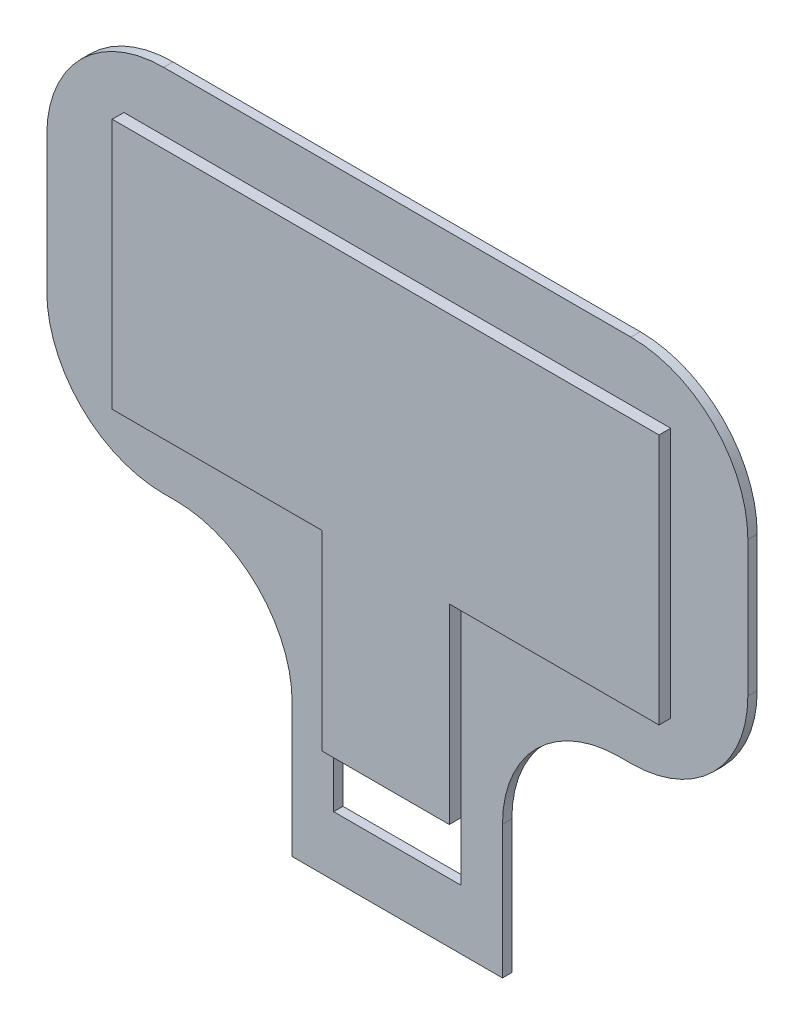
ISO-10303-21;
HEADER;
FILE_DESCRIPTION(('STEP AP214'),'2;1');
FILE_NAME('part.step','',(''),(''),'','','');
FILE_SCHEMA(('AUTOMOTIVE_DESIGN { 1 0 10303 214 1 1 1 1 }'));
ENDSEC;
DATA;
#1=APPLICATION_CONTEXT('core data for automotive mechanical design processes');
#2=APPLICATION_PROTOCOL_DEFINITION('international standard','automotive_design',2000,#1);
#3=PRODUCT_CONTEXT('',#1,'mechanical');
#4=PRODUCT('Part','Part','',(#3));
#5=PRODUCT_RELATED_PRODUCT_CATEGORY('part','',(#4));
#6=PRODUCT_DEFINITION_FORMATION('','',#4);
#7=PRODUCT_DEFINITION_CONTEXT('part definition',#1,'design');
#8=PRODUCT_DEFINITION('design','',#6,#7);
#9=PRODUCT_DEFINITION_SHAPE('','',#8);
#10=(LENGTH_UNIT() NAMED_UNIT(*) SI_UNIT(.MILLI.,.METRE.));
#11=(NAMED_UNIT(*) PLANE_ANGLE_UNIT() SI_UNIT($,.RADIAN.));
#12=(NAMED_UNIT(*) SI_UNIT($,.STERADIAN.) SOLID_ANGLE_UNIT());
#13=UNCERTAINTY_MEASURE_WITH_UNIT(LENGTH_MEASURE(1.E-05),#10,'distance_accuracy_value','');
#14=(GEOMETRIC_REPRESENTATION_CONTEXT(3) GLOBAL_UNCERTAINTY_ASSIGNED_CONTEXT((#13)) GLOBAL_UNIT_ASSIGNED_CONTEXT((#10,
#11,#12)) REPRESENTATION_CONTEXT('',''));
#15=CARTESIAN_POINT('',(0.,0.,0.));
#16=DIRECTION('',(0.,0.,1.));
#17=DIRECTION('',(1.,0.,0.));
#18=AXIS2_PLACEMENT_3D('',#15,#16,#17);
#19=CARTESIAN_POINT('',(0.,0.,0.8));
#20=DIRECTION('',(1.,0.,0.));
#21=DIRECTION('',(0.,0.,-1.));
#22=AXIS2_PLACEMENT_3D('',#19,#20,#21);
#23=PLANE('',#22);
#24=DIRECTION('',(0.,-1.,0.));
#25=VECTOR('',#24,1.);
#26=CARTESIAN_POINT('',(0.,0.,0.));
#27=LINE('',#26,#25);
#28=CARTESIAN_POINT('',(0.,43.,0.));
#29=VERTEX_POINT('',#28);
#30=CARTESIAN_POINT('',(0.,31.4,0.));
#31=VERTEX_POINT('',#30);
#32=EDGE_CURVE('E359',#29,#31,#27,.T.);
#33=ORIENTED_EDGE('',*,*,#32,.T.);
#34=DIRECTION('',(0.,0.,1.));
#35=VECTOR('',#34,1.);
#36=CARTESIAN_POINT('',(0.,31.4,0.));
#37=LINE('',#36,#35);
#38=CARTESIAN_POINT('',(0.,31.4,0.8));
#39=VERTEX_POINT('',#38);
#40=EDGE_CURVE('E302',#31,#39,#37,.T.);
#41=ORIENTED_EDGE('',*,*,#40,.T.);
#42=DIRECTION('',(0.,-1.,0.));
#43=VECTOR('',#42,1.);
#44=CARTESIAN_POINT('',(0.,0.,0.8));
#45=LINE('',#44,#43);
#46=CARTESIAN_POINT('',(0.,43.,0.8));
#47=VERTEX_POINT('',#46);
#48=EDGE_CURVE('E362',#47,#39,#45,.T.);
#49=ORIENTED_EDGE('',*,*,#48,.F.);
#50=DIRECTION('',(0.,0.,1.));
#51=VECTOR('',#50,1.);
#52=CARTESIAN_POINT('',(0.,43.,0.));
#53=LINE('',#52,#51);
#54=EDGE_CURVE('E357',#29,#47,#53,.T.);
#55=ORIENTED_EDGE('',*,*,#54,.F.);
#56=EDGE_LOOP('',(#33,#41,#49,#55));
#57=FACE_BOUND('',#56,.T.);
#58=ADVANCED_FACE('F38',(#57),#23,.F.);
#59=CARTESIAN_POINT('',(0.,0.,0.8));
#60=DIRECTION('',(0.,1.,0.));
#61=DIRECTION('',(0.,0.,1.));
#62=AXIS2_PLACEMENT_3D('',#59,#60,#61);
#63=PLANE('',#62);
#64=DIRECTION('',(0.,0.,1.));
#65=VECTOR('',#64,1.);
#66=CARTESIAN_POINT('',(39.,0.,0.));
#67=LINE('',#66,#65);
#68=CARTESIAN_POINT('',(39.,0.,0.));
#69=VERTEX_POINT('',#68);
#70=CARTESIAN_POINT('',(39.,0.,0.8));
#71=VERTEX_POINT('',#70);
#72=EDGE_CURVE('E338',#69,#71,#67,.T.);
#73=ORIENTED_EDGE('',*,*,#72,.T.);
#74=DIRECTION('',(1.,0.,0.));
#75=VECTOR('',#74,1.);
#76=CARTESIAN_POINT('',(0.,0.,0.8));
#77=LINE('',#76,#75);
#78=CARTESIAN_POINT('',(21.,0.,0.8));
#79=VERTEX_POINT('',#78);
#80=EDGE_CURVE('E365',#79,#71,#77,.T.);
#81=ORIENTED_EDGE('',*,*,#80,.F.);
#82=DIRECTION('',(0.,0.,1.));
#83=VECTOR('',#82,1.);
#84=CARTESIAN_POINT('',(21.,0.,0.));
#85=LINE('',#84,#83);
#86=CARTESIAN_POINT('',(21.,0.,0.));
#87=VERTEX_POINT('',#86);
#88=EDGE_CURVE('E299',#87,#79,#85,.T.);
#89=ORIENTED_EDGE('',*,*,#88,.F.);
#90=DIRECTION('',(1.,0.,0.));
#91=VECTOR('',#90,1.);
#92=CARTESIAN_POINT('',(0.,0.,0.));
#93=LINE('',#92,#91);
#94=EDGE_CURVE('E372',#87,#69,#93,.T.);
#95=ORIENTED_EDGE('',*,*,#94,.T.);
#96=EDGE_LOOP('',(#73,#81,#89,#95));
#97=FACE_BOUND('',#96,.T.);
#98=ADVANCED_FACE('F419',(#97),#63,.F.);
#99=CARTESIAN_POINT('',(60.,0.,0.8));
#100=DIRECTION('',(-1.,0.,0.));
#101=DIRECTION('',(0.,0.,1.));
#102=AXIS2_PLACEMENT_3D('',#99,#100,#101);
#103=PLANE('',#102);
#104=DIRECTION('',(0.,0.,1.));
#105=VECTOR('',#104,1.);
#106=CARTESIAN_POINT('',(60.,43.,0.));
#107=LINE('',#106,#105);
#108=CARTESIAN_POINT('',(60.,43.,0.));
#109=VERTEX_POINT('',#108);
#110=CARTESIAN_POINT('',(60.,43.,0.8));
#111=VERTEX_POINT('',#110);
#112=EDGE_CURVE('E326',#109,#111,#107,.T.);
#113=ORIENTED_EDGE('',*,*,#112,.T.);
#114=DIRECTION('',(0.,1.,0.));
#115=VECTOR('',#114,1.);
#116=CARTESIAN_POINT('',(60.,0.,0.8));
#117=LINE('',#116,#115);
#118=CARTESIAN_POINT('',(60.,31.4,0.8));
#119=VERTEX_POINT('',#118);
#120=EDGE_CURVE('E46',#119,#111,#117,.T.);
#121=ORIENTED_EDGE('',*,*,#120,.F.);
#122=DIRECTION('',(0.,0.,1.));
#123=VECTOR('',#122,1.);
#124=CARTESIAN_POINT('',(60.,31.4,0.));
#125=LINE('',#124,#123);
#126=CARTESIAN_POINT('',(60.,31.4,0.));
#127=VERTEX_POINT('',#126);
#128=EDGE_CURVE('E336',#127,#119,#125,.T.);
#129=ORIENTED_EDGE('',*,*,#128,.F.);
#130=DIRECTION('',(0.,1.,0.));
#131=VECTOR('',#130,1.);
#132=CARTESIAN_POINT('',(60.,0.,0.));
#133=LINE('',#132,#131);
#134=EDGE_CURVE('E374',#127,#109,#133,.T.);
#135=ORIENTED_EDGE('',*,*,#134,.T.);
#136=EDGE_LOOP('',(#113,#121,#129,#135));
#137=FACE_BOUND('',#136,.T.);
#138=ADVANCED_FACE('F401',(#137),#103,.F.);
#139=CARTESIAN_POINT('',(0.,0.,0.8));
#140=DIRECTION('',(0.,0.,-1.));
#141=DIRECTION('',(-1.,0.,0.));
#142=AXIS2_PLACEMENT_3D('',#139,#140,#141);
#143=PLANE('',#142);
#144=DIRECTION('',(1.,0.,0.));
#145=VECTOR('',#144,1.);
#146=CARTESIAN_POINT('',(0.,47.95,0.8));
#147=LINE('',#146,#145);
#148=CARTESIAN_POINT('',(6.6,47.95,0.8));
#149=VERTEX_POINT('',#148);
#150=CARTESIAN_POINT('',(53.4,47.95,0.8));
#151=VERTEX_POINT('',#150);
#152=EDGE_CURVE('E241',#149,#151,#147,.T.);
#153=ORIENTED_EDGE('',*,*,#152,.T.);
#154=DIRECTION('',(0.,-1.,0.));
#155=VECTOR('',#154,1.);
#156=CARTESIAN_POINT('',(53.4,0.,0.8));
#157=LINE('',#156,#155);
#158=CARTESIAN_POINT('',(53.4,26.45,0.8));
#159=VERTEX_POINT('',#158);
#160=EDGE_CURVE('E238',#151,#159,#157,.T.);
#161=ORIENTED_EDGE('',*,*,#160,.T.);
#162=DIRECTION('',(1.,0.,0.));
#163=VECTOR('',#162,1.);
#164=CARTESIAN_POINT('',(0.,26.45,0.8));
#165=LINE('',#164,#163);
#166=CARTESIAN_POINT('',(35.45,26.45,0.8));
#167=VERTEX_POINT('',#166);
#168=EDGE_CURVE('E250',#167,#159,#165,.T.);
#169=ORIENTED_EDGE('',*,*,#168,.F.);
#170=DIRECTION('',(0.,1.,0.));
#171=VECTOR('',#170,1.);
#172=CARTESIAN_POINT('',(35.45,0.,0.8));
#173=LINE('',#172,#171);
#174=CARTESIAN_POINT('',(35.45,10.1,0.8));
#175=VERTEX_POINT('',#174);
#176=EDGE_CURVE('E255',#175,#167,#173,.T.);
#177=ORIENTED_EDGE('',*,*,#176,.F.);
#178=CARTESIAN_POINT('',(35.45,5.1,0.8));
#179=VERTEX_POINT('',#178);
#180=EDGE_CURVE('E256',#179,#175,#173,.T.);
#181=ORIENTED_EDGE('',*,*,#180,.F.);
#182=DIRECTION('',(1.,0.,0.));
#183=VECTOR('',#182,1.);
#184=CARTESIAN_POINT('',(0.,5.1,0.8));
#185=LINE('',#184,#183);
#186=CARTESIAN_POINT('',(24.55,5.1,0.8));
#187=VERTEX_POINT('',#186);
#188=EDGE_CURVE('E253',#187,#179,#185,.T.);
#189=ORIENTED_EDGE('',*,*,#188,.F.);
#190=DIRECTION('',(0.,1.,0.));
#191=VECTOR('',#190,1.);
#192=CARTESIAN_POINT('',(24.55,0.,0.8));
#193=LINE('',#192,#191);
#194=CARTESIAN_POINT('',(24.55,10.1,0.8));
#195=VERTEX_POINT('',#194);
#196=EDGE_CURVE('E251',#187,#195,#193,.T.);
#197=ORIENTED_EDGE('',*,*,#196,.T.);
#198=CARTESIAN_POINT('',(24.55,26.45,0.8));
#199=VERTEX_POINT('',#198);
#200=EDGE_CURVE('E221',#195,#199,#193,.T.);
#201=ORIENTED_EDGE('',*,*,#200,.T.);
#202=CARTESIAN_POINT('',(6.6,26.45,0.8));
#203=VERTEX_POINT('',#202);
#204=EDGE_CURVE('E247',#203,#199,#165,.T.);
#205=ORIENTED_EDGE('',*,*,#204,.F.);
#206=DIRECTION('',(0.,-1.,0.));
#207=VECTOR('',#206,1.);
#208=CARTESIAN_POINT('',(6.6,0.,0.8));
#209=LINE('',#208,#207);
#210=EDGE_CURVE('E245',#149,#203,#209,.T.);
#211=ORIENTED_EDGE('',*,*,#210,.F.);
#212=EDGE_LOOP('',(#153,#161,#169,#177,#181,#189,#197,#201,#205,#211));
#213=FACE_BOUND('',#212,.T.);
#214=ORIENTED_EDGE('',*,*,#120,.T.);
#215=CARTESIAN_POINT('',(50.,43.,0.8));
#216=DIRECTION('',(0.,0.,1.));
#217=DIRECTION('',(1.,0.,0.));
#218=AXIS2_PLACEMENT_3D('',#215,#216,#217);
#219=CIRCLE('',#218,10.);
#220=CARTESIAN_POINT('',(50.,53.,0.8));
#221=VERTEX_POINT('',#220);
#222=EDGE_CURVE('E273',#221,#111,#219,.F.);
#223=ORIENTED_EDGE('',*,*,#222,.F.);
#224=DIRECTION('',(-1.,0.,0.));
#225=VECTOR('',#224,1.);
#226=CARTESIAN_POINT('',(0.,53.,0.8));
#227=LINE('',#226,#225);
#228=CARTESIAN_POINT('',(10.,53.,0.8));
#229=VERTEX_POINT('',#228);
#230=EDGE_CURVE('E11',#221,#229,#227,.T.);
#231=ORIENTED_EDGE('',*,*,#230,.T.);
#232=CARTESIAN_POINT('',(10.,43.,0.8));
#233=DIRECTION('',(0.,0.,1.));
#234=DIRECTION('',(1.,0.,0.));
#235=AXIS2_PLACEMENT_3D('',#232,#233,#234);
#236=CIRCLE('',#235,10.);
#237=EDGE_CURVE('E301',#229,#47,#236,.T.);
#238=ORIENTED_EDGE('',*,*,#237,.T.);
#239=ORIENTED_EDGE('',*,*,#48,.T.);
#240=CARTESIAN_POINT('',(10.,31.4,0.8));
#241=DIRECTION('',(0.,0.,1.));
#242=DIRECTION('',(1.,0.,0.));
#243=AXIS2_PLACEMENT_3D('',#240,#241,#242);
#244=CIRCLE('',#243,10.);
#245=CARTESIAN_POINT('',(10.,21.4,0.8));
#246=VERTEX_POINT('',#245);
#247=EDGE_CURVE('E278',#39,#246,#244,.T.);
#248=ORIENTED_EDGE('',*,*,#247,.T.);
#249=DIRECTION('',(1.,0.,0.));
#250=VECTOR('',#249,1.);
#251=CARTESIAN_POINT('',(0.,21.4,0.8));
#252=LINE('',#251,#250);
#253=CARTESIAN_POINT('',(11.,21.4,0.8));
#254=VERTEX_POINT('',#253);
#255=EDGE_CURVE('E294',#246,#254,#252,.T.);
#256=ORIENTED_EDGE('',*,*,#255,.T.);
#257=CARTESIAN_POINT('',(11.,11.4,0.8));
#258=DIRECTION('',(0.,0.,1.));
#259=DIRECTION('',(1.,0.,0.));
#260=AXIS2_PLACEMENT_3D('',#257,#258,#259);
#261=CIRCLE('',#260,10.);
#262=CARTESIAN_POINT('',(21.,11.4,0.8));
#263=VERTEX_POINT('',#262);
#264=EDGE_CURVE('E290',#263,#254,#261,.T.);
#265=ORIENTED_EDGE('',*,*,#264,.F.);
#266=DIRECTION('',(0.,1.,0.));
#267=VECTOR('',#266,1.);
#268=CARTESIAN_POINT('',(21.,0.,0.8));
#269=LINE('',#268,#267);
#270=EDGE_CURVE('E287',#79,#263,#269,.T.);
#271=ORIENTED_EDGE('',*,*,#270,.F.);
#272=ORIENTED_EDGE('',*,*,#80,.T.);
#273=DIRECTION('',(0.,1.,0.));
#274=VECTOR('',#273,1.);
#275=CARTESIAN_POINT('',(39.,0.,0.8));
#276=LINE('',#275,#274);
#277=CARTESIAN_POINT('',(39.,11.4,0.8));
#278=VERTEX_POINT('',#277);
#279=EDGE_CURVE('E329',#71,#278,#276,.T.);
#280=ORIENTED_EDGE('',*,*,#279,.T.);
#281=CARTESIAN_POINT('',(49.,11.4,0.8));
#282=DIRECTION('',(0.,0.,1.));
#283=DIRECTION('',(1.,0.,0.));
#284=AXIS2_PLACEMENT_3D('',#281,#282,#283);
#285=CIRCLE('',#284,10.);
#286=CARTESIAN_POINT('',(49.,21.4,0.8));
#287=VERTEX_POINT('',#286);
#288=EDGE_CURVE('E325',#287,#278,#285,.T.);
#289=ORIENTED_EDGE('',*,*,#288,.F.);
#290=DIRECTION('',(1.,0.,0.));
#291=VECTOR('',#290,1.);
#292=CARTESIAN_POINT('',(0.,21.4,0.8));
#293=LINE('',#292,#291);
#294=CARTESIAN_POINT('',(50.,21.4,0.8));
#295=VERTEX_POINT('',#294);
#296=EDGE_CURVE('E322',#287,#295,#293,.T.);
#297=ORIENTED_EDGE('',*,*,#296,.T.);
#298=CARTESIAN_POINT('',(50.,31.4,0.8));
#299=DIRECTION('',(0.,0.,1.));
#300=DIRECTION('',(1.,0.,0.));
#301=AXIS2_PLACEMENT_3D('',#298,#299,#300);
#302=CIRCLE('',#301,10.);
#303=EDGE_CURVE('E313',#295,#119,#302,.T.);
#304=ORIENTED_EDGE('',*,*,#303,.T.);
#305=EDGE_LOOP('',(#214,#223,#231,#238,#239,#248,#256,#265,#271,#272,#280,#289,#297,#304));
#306=FACE_BOUND('',#305,.T.);
#307=ADVANCED_FACE('F396',(#213,#306),#143,.F.);
#308=CARTESIAN_POINT('',(0.,0.,0.));
#309=DIRECTION('',(0.,0.,-1.));
#310=DIRECTION('',(-1.,0.,0.));
#311=AXIS2_PLACEMENT_3D('',#308,#309,#310);
#312=PLANE('',#311);
#313=DIRECTION('',(0.,1.,0.));
#314=VECTOR('',#313,1.);
#315=CARTESIAN_POINT('',(24.55,0.,0.));
#316=LINE('',#315,#314);
#317=CARTESIAN_POINT('',(24.55,5.1,0.));
#318=VERTEX_POINT('',#317);
#319=CARTESIAN_POINT('',(24.55,10.1,0.));
#320=VERTEX_POINT('',#319);
#321=EDGE_CURVE('E242',#318,#320,#316,.T.);
#322=ORIENTED_EDGE('',*,*,#321,.F.);
#323=DIRECTION('',(-1.,0.,0.));
#324=VECTOR('',#323,1.);
#325=CARTESIAN_POINT('',(0.,5.1,0.));
#326=LINE('',#325,#324);
#327=CARTESIAN_POINT('',(35.45,5.1,0.));
#328=VERTEX_POINT('',#327);
#329=EDGE_CURVE('E694',#328,#318,#326,.T.);
#330=ORIENTED_EDGE('',*,*,#329,.F.);
#331=DIRECTION('',(0.,-1.,0.));
#332=VECTOR('',#331,1.);
#333=CARTESIAN_POINT('',(35.45,0.,0.));
#334=LINE('',#333,#332);
#335=CARTESIAN_POINT('',(35.45,10.1,0.));
#336=VERTEX_POINT('',#335);
#337=EDGE_CURVE('E687',#336,#328,#334,.T.);
#338=ORIENTED_EDGE('',*,*,#337,.F.);
#339=DIRECTION('',(1.,0.,0.));
#340=VECTOR('',#339,1.);
#341=CARTESIAN_POINT('',(0.,10.1,0.));
#342=LINE('',#341,#340);
#343=EDGE_CURVE('E693',#320,#336,#342,.T.);
#344=ORIENTED_EDGE('',*,*,#343,.F.);
#345=EDGE_LOOP('',(#322,#330,#338,#344));
#346=FACE_BOUND('',#345,.T.);
#347=CARTESIAN_POINT('',(50.,43.,0.));
#348=DIRECTION('',(0.,0.,1.));
#349=DIRECTION('',(1.,0.,0.));
#350=AXIS2_PLACEMENT_3D('',#347,#348,#349);
#351=CIRCLE('',#350,10.);
#352=CARTESIAN_POINT('',(50.,53.,0.));
#353=VERTEX_POINT('',#352);
#354=EDGE_CURVE('E344',#353,#109,#351,.F.);
#355=ORIENTED_EDGE('',*,*,#354,.T.);
#356=ORIENTED_EDGE('',*,*,#134,.F.);
#357=CARTESIAN_POINT('',(50.,31.4,0.));
#358=DIRECTION('',(0.,0.,1.));
#359=DIRECTION('',(1.,0.,0.));
#360=AXIS2_PLACEMENT_3D('',#357,#358,#359);
#361=CIRCLE('',#360,10.);
#362=CARTESIAN_POINT('',(50.,21.4,0.));
#363=VERTEX_POINT('',#362);
#364=EDGE_CURVE('E319',#363,#127,#361,.T.);
#365=ORIENTED_EDGE('',*,*,#364,.F.);
#366=DIRECTION('',(1.,0.,0.));
#367=VECTOR('',#366,1.);
#368=CARTESIAN_POINT('',(0.,21.4,0.));
#369=LINE('',#368,#367);
#370=CARTESIAN_POINT('',(49.,21.4,0.));
#371=VERTEX_POINT('',#370);
#372=EDGE_CURVE('E310',#371,#363,#369,.T.);
#373=ORIENTED_EDGE('',*,*,#372,.F.);
#374=CARTESIAN_POINT('',(49.,11.4,0.));
#375=DIRECTION('',(0.,0.,1.));
#376=DIRECTION('',(1.,0.,0.));
#377=AXIS2_PLACEMENT_3D('',#374,#375,#376);
#378=CIRCLE('',#377,10.);
#379=CARTESIAN_POINT('',(39.,11.4,0.));
#380=VERTEX_POINT('',#379);
#381=EDGE_CURVE('E312',#371,#380,#378,.T.);
#382=ORIENTED_EDGE('',*,*,#381,.T.);
#383=DIRECTION('',(0.,1.,0.));
#384=VECTOR('',#383,1.);
#385=CARTESIAN_POINT('',(39.,0.,0.));
#386=LINE('',#385,#384);
#387=EDGE_CURVE('E316',#69,#380,#386,.T.);
#388=ORIENTED_EDGE('',*,*,#387,.F.);
#389=ORIENTED_EDGE('',*,*,#94,.F.);
#390=DIRECTION('',(0.,1.,0.));
#391=VECTOR('',#390,1.);
#392=CARTESIAN_POINT('',(21.,0.,0.));
#393=LINE('',#392,#391);
#394=CARTESIAN_POINT('',(21.,11.4,0.));
#395=VERTEX_POINT('',#394);
#396=EDGE_CURVE('E274',#87,#395,#393,.T.);
#397=ORIENTED_EDGE('',*,*,#396,.T.);
#398=CARTESIAN_POINT('',(11.,11.4,0.));
#399=DIRECTION('',(0.,0.,1.));
#400=DIRECTION('',(1.,0.,0.));
#401=AXIS2_PLACEMENT_3D('',#398,#399,#400);
#402=CIRCLE('',#401,10.);
#403=CARTESIAN_POINT('',(11.,21.4,0.));
#404=VERTEX_POINT('',#403);
#405=EDGE_CURVE('E277',#395,#404,#402,.T.);
#406=ORIENTED_EDGE('',*,*,#405,.T.);
#407=DIRECTION('',(1.,0.,0.));
#408=VECTOR('',#407,1.);
#409=CARTESIAN_POINT('',(0.,21.4,0.));
#410=LINE('',#409,#408);
#411=CARTESIAN_POINT('',(10.,21.4,0.));
#412=VERTEX_POINT('',#411);
#413=EDGE_CURVE('E281',#412,#404,#410,.T.);
#414=ORIENTED_EDGE('',*,*,#413,.F.);
#415=CARTESIAN_POINT('',(10.,31.4,0.));
#416=DIRECTION('',(0.,0.,1.));
#417=DIRECTION('',(1.,0.,0.));
#418=AXIS2_PLACEMENT_3D('',#415,#416,#417);
#419=CIRCLE('',#418,10.);
#420=EDGE_CURVE('E284',#31,#412,#419,.T.);
#421=ORIENTED_EDGE('',*,*,#420,.F.);
#422=ORIENTED_EDGE('',*,*,#32,.F.);
#423=CARTESIAN_POINT('',(10.,43.,0.));
#424=DIRECTION('',(0.,0.,1.));
#425=DIRECTION('',(1.,0.,0.));
#426=AXIS2_PLACEMENT_3D('',#423,#424,#425);
#427=CIRCLE('',#426,10.);
#428=CARTESIAN_POINT('',(10.,53.,0.));
#429=VERTEX_POINT('',#428);
#430=EDGE_CURVE('E352',#429,#29,#427,.T.);
#431=ORIENTED_EDGE('',*,*,#430,.F.);
#432=DIRECTION('',(-1.,0.,0.));
#433=VECTOR('',#432,1.);
#434=CARTESIAN_POINT('',(0.,53.,0.));
#435=LINE('',#434,#433);
#436=EDGE_CURVE('E41',#353,#429,#435,.T.);
#437=ORIENTED_EDGE('',*,*,#436,.F.);
#438=EDGE_LOOP('',(#355,#356,#365,#373,#382,#388,#389,#397,#406,#414,#421,#422,#431,#437));
#439=FACE_BOUND('',#438,.T.);
#440=ADVANCED_FACE('F387',(#346,#439),#312,.T.);
#441=CARTESIAN_POINT('',(0.,53.,0.8));
#442=DIRECTION('',(0.,-1.,0.));
#443=DIRECTION('',(0.,0.,-1.));
#444=AXIS2_PLACEMENT_3D('',#441,#442,#443);
#445=PLANE('',#444);
#446=ORIENTED_EDGE('',*,*,#230,.F.);
#447=DIRECTION('',(0.,0.,1.));
#448=VECTOR('',#447,1.);
#449=CARTESIAN_POINT('',(50.,53.,0.));
#450=LINE('',#449,#448);
#451=EDGE_CURVE('E347',#353,#221,#450,.T.);
#452=ORIENTED_EDGE('',*,*,#451,.F.);
#453=ORIENTED_EDGE('',*,*,#436,.T.);
#454=DIRECTION('',(0.,0.,1.));
#455=VECTOR('',#454,1.);
#456=CARTESIAN_POINT('',(10.,53.,0.));
#457=LINE('',#456,#455);
#458=EDGE_CURVE('E354',#429,#229,#457,.T.);
#459=ORIENTED_EDGE('',*,*,#458,.T.);
#460=EDGE_LOOP('',(#446,#452,#453,#459));
#461=FACE_BOUND('',#460,.T.);
#462=ADVANCED_FACE('F384',(#461),#445,.F.);
#463=CARTESIAN_POINT('',(10.,43.,0.));
#464=DIRECTION('',(0.,0.,1.));
#465=DIRECTION('',(1.,0.,0.));
#466=AXIS2_PLACEMENT_3D('',#463,#464,#465);
#467=CYLINDRICAL_SURFACE('',#466,10.);
#468=ORIENTED_EDGE('',*,*,#237,.F.);
#469=ORIENTED_EDGE('',*,*,#458,.F.);
#470=ORIENTED_EDGE('',*,*,#430,.T.);
#471=ORIENTED_EDGE('',*,*,#54,.T.);
#472=EDGE_LOOP('',(#468,#469,#470,#471));
#473=FACE_BOUND('',#472,.T.);
#474=ADVANCED_FACE('F392',(#473),#467,.T.);
#475=CARTESIAN_POINT('',(21.,0.,0.));
#476=DIRECTION('',(1.,0.,0.));
#477=DIRECTION('',(0.,0.,-1.));
#478=AXIS2_PLACEMENT_3D('',#475,#476,#477);
#479=PLANE('',#478);
#480=ORIENTED_EDGE('',*,*,#270,.T.);
#481=DIRECTION('',(0.,0.,1.));
#482=VECTOR('',#481,1.);
#483=CARTESIAN_POINT('',(21.,11.4,0.));
#484=LINE('',#483,#482);
#485=EDGE_CURVE('E286',#395,#263,#484,.T.);
#486=ORIENTED_EDGE('',*,*,#485,.F.);
#487=ORIENTED_EDGE('',*,*,#396,.F.);
#488=ORIENTED_EDGE('',*,*,#88,.T.);
#489=EDGE_LOOP('',(#480,#486,#487,#488));
#490=FACE_BOUND('',#489,.T.);
#491=ADVANCED_FACE('F423',(#490),#479,.F.);
#492=CARTESIAN_POINT('',(10.,31.4,0.));
#493=DIRECTION('',(0.,0.,1.));
#494=DIRECTION('',(1.,0.,0.));
#495=AXIS2_PLACEMENT_3D('',#492,#493,#494);
#496=CYLINDRICAL_SURFACE('',#495,10.);
#497=ORIENTED_EDGE('',*,*,#247,.F.);
#498=ORIENTED_EDGE('',*,*,#40,.F.);
#499=ORIENTED_EDGE('',*,*,#420,.T.);
#500=DIRECTION('',(0.,0.,1.));
#501=VECTOR('',#500,1.);
#502=CARTESIAN_POINT('',(10.,21.4,0.));
#503=LINE('',#502,#501);
#504=EDGE_CURVE('E305',#412,#246,#503,.T.);
#505=ORIENTED_EDGE('',*,*,#504,.T.);
#506=EDGE_LOOP('',(#497,#498,#499,#505));
#507=FACE_BOUND('',#506,.T.);
#508=ADVANCED_FACE('F434',(#507),#496,.T.);
#509=CARTESIAN_POINT('',(0.,21.4,0.));
#510=DIRECTION('',(0.,-1.,0.));
#511=DIRECTION('',(0.,0.,-1.));
#512=AXIS2_PLACEMENT_3D('',#509,#510,#511);
#513=PLANE('',#512);
#514=ORIENTED_EDGE('',*,*,#255,.F.);
#515=ORIENTED_EDGE('',*,*,#504,.F.);
#516=ORIENTED_EDGE('',*,*,#413,.T.);
#517=DIRECTION('',(0.,0.,1.));
#518=VECTOR('',#517,1.);
#519=CARTESIAN_POINT('',(11.,21.4,0.));
#520=LINE('',#519,#518);
#521=EDGE_CURVE('E307',#404,#254,#520,.T.);
#522=ORIENTED_EDGE('',*,*,#521,.T.);
#523=EDGE_LOOP('',(#514,#515,#516,#522));
#524=FACE_BOUND('',#523,.T.);
#525=ADVANCED_FACE('F432',(#524),#513,.T.);
#526=CARTESIAN_POINT('',(11.,11.4,0.));
#527=DIRECTION('',(0.,0.,1.));
#528=DIRECTION('',(1.,0.,0.));
#529=AXIS2_PLACEMENT_3D('',#526,#527,#528);
#530=CYLINDRICAL_SURFACE('',#529,10.);
#531=ORIENTED_EDGE('',*,*,#264,.T.);
#532=ORIENTED_EDGE('',*,*,#521,.F.);
#533=ORIENTED_EDGE('',*,*,#405,.F.);
#534=ORIENTED_EDGE('',*,*,#485,.T.);
#535=EDGE_LOOP('',(#531,#532,#533,#534));
#536=FACE_BOUND('',#535,.T.);
#537=ADVANCED_FACE('F427',(#536),#530,.F.);
#538=CARTESIAN_POINT('',(0.,21.4,0.));
#539=DIRECTION('',(0.,-1.,0.));
#540=DIRECTION('',(0.,0.,-1.));
#541=AXIS2_PLACEMENT_3D('',#538,#539,#540);
#542=PLANE('',#541);
#543=ORIENTED_EDGE('',*,*,#296,.F.);
#544=DIRECTION('',(0.,0.,1.));
#545=VECTOR('',#544,1.);
#546=CARTESIAN_POINT('',(49.,21.4,0.));
#547=LINE('',#546,#545);
#548=EDGE_CURVE('E321',#371,#287,#547,.T.);
#549=ORIENTED_EDGE('',*,*,#548,.F.);
#550=ORIENTED_EDGE('',*,*,#372,.T.);
#551=DIRECTION('',(0.,0.,1.));
#552=VECTOR('',#551,1.);
#553=CARTESIAN_POINT('',(50.,21.4,0.));
#554=LINE('',#553,#552);
#555=EDGE_CURVE('E291',#363,#295,#554,.T.);
#556=ORIENTED_EDGE('',*,*,#555,.T.);
#557=EDGE_LOOP('',(#543,#549,#550,#556));
#558=FACE_BOUND('',#557,.T.);
#559=ADVANCED_FACE('F409',(#558),#542,.T.);
#560=CARTESIAN_POINT('',(50.,31.4,0.));
#561=DIRECTION('',(0.,0.,1.));
#562=DIRECTION('',(1.,0.,0.));
#563=AXIS2_PLACEMENT_3D('',#560,#561,#562);
#564=CYLINDRICAL_SURFACE('',#563,10.);
#565=ORIENTED_EDGE('',*,*,#303,.F.);
#566=ORIENTED_EDGE('',*,*,#555,.F.);
#567=ORIENTED_EDGE('',*,*,#364,.T.);
#568=ORIENTED_EDGE('',*,*,#128,.T.);
#569=EDGE_LOOP('',(#565,#566,#567,#568));
#570=FACE_BOUND('',#569,.T.);
#571=ADVANCED_FACE('F406',(#570),#564,.T.);
#572=CARTESIAN_POINT('',(39.,0.,0.));
#573=DIRECTION('',(1.,0.,0.));
#574=DIRECTION('',(0.,0.,-1.));
#575=AXIS2_PLACEMENT_3D('',#572,#573,#574);
#576=PLANE('',#575);
#577=ORIENTED_EDGE('',*,*,#279,.F.);
#578=ORIENTED_EDGE('',*,*,#72,.F.);
#579=ORIENTED_EDGE('',*,*,#387,.T.);
#580=DIRECTION('',(0.,0.,1.));
#581=VECTOR('',#580,1.);
#582=CARTESIAN_POINT('',(39.,11.4,0.));
#583=LINE('',#582,#581);
#584=EDGE_CURVE('E341',#380,#278,#583,.T.);
#585=ORIENTED_EDGE('',*,*,#584,.T.);
#586=EDGE_LOOP('',(#577,#578,#579,#585));
#587=FACE_BOUND('',#586,.T.);
#588=ADVANCED_FACE('F470',(#587),#576,.T.);
#589=CARTESIAN_POINT('',(49.,11.4,0.));
#590=DIRECTION('',(0.,0.,1.));
#591=DIRECTION('',(1.,0.,0.));
#592=AXIS2_PLACEMENT_3D('',#589,#590,#591);
#593=CYLINDRICAL_SURFACE('',#592,10.);
#594=ORIENTED_EDGE('',*,*,#288,.T.);
#595=ORIENTED_EDGE('',*,*,#584,.F.);
#596=ORIENTED_EDGE('',*,*,#381,.F.);
#597=ORIENTED_EDGE('',*,*,#548,.T.);
#598=EDGE_LOOP('',(#594,#595,#596,#597));
#599=FACE_BOUND('',#598,.T.);
#600=ADVANCED_FACE('F412',(#599),#593,.F.);
#601=CARTESIAN_POINT('',(50.,43.,0.));
#602=DIRECTION('',(0.,0.,1.));
#603=DIRECTION('',(1.,0.,0.));
#604=AXIS2_PLACEMENT_3D('',#601,#602,#603);
#605=CYLINDRICAL_SURFACE('',#604,10.);
#606=ORIENTED_EDGE('',*,*,#222,.T.);
#607=ORIENTED_EDGE('',*,*,#112,.F.);
#608=ORIENTED_EDGE('',*,*,#354,.F.);
#609=ORIENTED_EDGE('',*,*,#451,.T.);
#610=EDGE_LOOP('',(#606,#607,#608,#609));
#611=FACE_BOUND('',#610,.T.);
#612=ADVANCED_FACE('F400',(#611),#605,.T.);
#613=CARTESIAN_POINT('',(53.4,0.,1.8));
#614=DIRECTION('',(1.,0.,0.));
#615=DIRECTION('',(0.,0.,-1.));
#616=AXIS2_PLACEMENT_3D('',#613,#614,#615);
#617=PLANE('',#616);
#618=ORIENTED_EDGE('',*,*,#160,.F.);
#619=DIRECTION('',(0.,0.,-1.));
#620=VECTOR('',#619,1.);
#621=CARTESIAN_POINT('',(53.4,47.95,1.8));
#622=LINE('',#621,#620);
#623=CARTESIAN_POINT('',(53.4,47.95,1.8));
#624=VERTEX_POINT('',#623);
#625=EDGE_CURVE('E270',#624,#151,#622,.T.);
#626=ORIENTED_EDGE('',*,*,#625,.F.);
#627=DIRECTION('',(0.,-1.,0.));
#628=VECTOR('',#627,1.);
#629=CARTESIAN_POINT('',(53.4,0.,1.8));
#630=LINE('',#629,#628);
#631=CARTESIAN_POINT('',(53.4,26.45,1.8));
#632=VERTEX_POINT('',#631);
#633=EDGE_CURVE('E701',#624,#632,#630,.T.);
#634=ORIENTED_EDGE('',*,*,#633,.T.);
#635=DIRECTION('',(0.,0.,-1.));
#636=VECTOR('',#635,1.);
#637=CARTESIAN_POINT('',(53.4,26.45,1.8));
#638=LINE('',#637,#636);
#639=EDGE_CURVE('E258',#632,#159,#638,.T.);
#640=ORIENTED_EDGE('',*,*,#639,.T.);
#641=EDGE_LOOP('',(#618,#626,#634,#640));
#642=FACE_BOUND('',#641,.T.);
#643=ADVANCED_FACE('F465',(#642),#617,.T.);
#644=CARTESIAN_POINT('',(0.,47.95,1.8));
#645=DIRECTION('',(0.,1.,0.));
#646=DIRECTION('',(0.,0.,1.));
#647=AXIS2_PLACEMENT_3D('',#644,#645,#646);
#648=PLANE('',#647);
#649=ORIENTED_EDGE('',*,*,#152,.F.);
#650=DIRECTION('',(0.,0.,-1.));
#651=VECTOR('',#650,1.);
#652=CARTESIAN_POINT('',(6.6,47.95,1.8));
#653=LINE('',#652,#651);
#654=CARTESIAN_POINT('',(6.6,47.95,1.8));
#655=VERTEX_POINT('',#654);
#656=EDGE_CURVE('E268',#655,#149,#653,.T.);
#657=ORIENTED_EDGE('',*,*,#656,.F.);
#658=DIRECTION('',(1.,0.,0.));
#659=VECTOR('',#658,1.);
#660=CARTESIAN_POINT('',(0.,47.95,1.8));
#661=LINE('',#660,#659);
#662=EDGE_CURVE('E704',#655,#624,#661,.T.);
#663=ORIENTED_EDGE('',*,*,#662,.T.);
#664=ORIENTED_EDGE('',*,*,#625,.T.);
#665=EDGE_LOOP('',(#649,#657,#663,#664));
#666=FACE_BOUND('',#665,.T.);
#667=ADVANCED_FACE('F506',(#666),#648,.T.);
#668=CARTESIAN_POINT('',(6.6,0.,1.8));
#669=DIRECTION('',(1.,0.,0.));
#670=DIRECTION('',(0.,1.,0.));
#671=AXIS2_PLACEMENT_3D('',#668,#669,#670);
#672=PLANE('',#671);
#673=ORIENTED_EDGE('',*,*,#210,.T.);
#674=DIRECTION('',(0.,0.,-1.));
#675=VECTOR('',#674,1.);
#676=CARTESIAN_POINT('',(6.6,26.45,1.8));
#677=LINE('',#676,#675);
#678=CARTESIAN_POINT('',(6.6,26.45,1.8));
#679=VERTEX_POINT('',#678);
#680=EDGE_CURVE('E265',#679,#203,#677,.T.);
#681=ORIENTED_EDGE('',*,*,#680,.F.);
#682=DIRECTION('',(0.,-1.,0.));
#683=VECTOR('',#682,1.);
#684=CARTESIAN_POINT('',(6.6,0.,1.8));
#685=LINE('',#684,#683);
#686=EDGE_CURVE('E234',#655,#679,#685,.T.);
#687=ORIENTED_EDGE('',*,*,#686,.F.);
#688=ORIENTED_EDGE('',*,*,#656,.T.);
#689=EDGE_LOOP('',(#673,#681,#687,#688));
#690=FACE_BOUND('',#689,.T.);
#691=ADVANCED_FACE('F513',(#690),#672,.F.);
#692=CARTESIAN_POINT('',(0.,26.45,1.8));
#693=DIRECTION('',(0.,1.,0.));
#694=DIRECTION('',(-1.,0.,0.));
#695=AXIS2_PLACEMENT_3D('',#692,#693,#694);
#696=PLANE('',#695);
#697=ORIENTED_EDGE('',*,*,#204,.T.);
#698=DIRECTION('',(0.,0.,-1.));
#699=VECTOR('',#698,1.);
#700=CARTESIAN_POINT('',(24.55,26.45,1.8));
#701=LINE('',#700,#699);
#702=CARTESIAN_POINT('',(24.55,26.45,1.8));
#703=VERTEX_POINT('',#702);
#704=EDGE_CURVE('E263',#703,#199,#701,.T.);
#705=ORIENTED_EDGE('',*,*,#704,.F.);
#706=DIRECTION('',(1.,0.,0.));
#707=VECTOR('',#706,1.);
#708=CARTESIAN_POINT('',(0.,26.45,1.8));
#709=LINE('',#708,#707);
#710=EDGE_CURVE('E228',#679,#703,#709,.T.);
#711=ORIENTED_EDGE('',*,*,#710,.F.);
#712=ORIENTED_EDGE('',*,*,#680,.T.);
#713=EDGE_LOOP('',(#697,#705,#711,#712));
#714=FACE_BOUND('',#713,.T.);
#715=ADVANCED_FACE('F521',(#714),#696,.F.);
#716=CARTESIAN_POINT('',(24.55,0.,1.8));
#717=DIRECTION('',(-1.,0.,0.));
#718=DIRECTION('',(0.,0.,1.));
#719=AXIS2_PLACEMENT_3D('',#716,#717,#718);
#720=PLANE('',#719);
#721=DIRECTION('',(0.,0.,1.));
#722=VECTOR('',#721,1.);
#723=CARTESIAN_POINT('',(24.55,10.1,-8.2));
#724=LINE('',#723,#722);
#725=CARTESIAN_POINT('',(24.55,10.1,1.8));
#726=VERTEX_POINT('',#725);
#727=EDGE_CURVE('E208',#195,#726,#724,.T.);
#728=ORIENTED_EDGE('',*,*,#727,.T.);
#729=DIRECTION('',(0.,1.,0.));
#730=VECTOR('',#729,1.);
#731=CARTESIAN_POINT('',(24.55,0.,1.8));
#732=LINE('',#731,#730);
#733=EDGE_CURVE('E219',#726,#703,#732,.T.);
#734=ORIENTED_EDGE('',*,*,#733,.T.);
#735=ORIENTED_EDGE('',*,*,#704,.T.);
#736=ORIENTED_EDGE('',*,*,#200,.F.);
#737=EDGE_LOOP('',(#728,#734,#735,#736));
#738=FACE_BOUND('',#737,.T.);
#739=ADVANCED_FACE('F217',(#738),#720,.T.);
#740=CARTESIAN_POINT('',(35.45,0.,1.8));
#741=DIRECTION('',(-1.,0.,0.));
#742=DIRECTION('',(0.,0.,1.));
#743=AXIS2_PLACEMENT_3D('',#740,#741,#742);
#744=PLANE('',#743);
#745=DIRECTION('',(0.,1.,0.));
#746=VECTOR('',#745,1.);
#747=CARTESIAN_POINT('',(35.45,0.,1.8));
#748=LINE('',#747,#746);
#749=CARTESIAN_POINT('',(35.45,10.1,1.8));
#750=VERTEX_POINT('',#749);
#751=CARTESIAN_POINT('',(35.45,26.45,1.8));
#752=VERTEX_POINT('',#751);
#753=EDGE_CURVE('E230',#750,#752,#748,.T.);
#754=ORIENTED_EDGE('',*,*,#753,.F.);
#755=DIRECTION('',(0.,0.,1.));
#756=VECTOR('',#755,1.);
#757=CARTESIAN_POINT('',(35.45,10.1,-8.2));
#758=LINE('',#757,#756);
#759=EDGE_CURVE('E62',#175,#750,#758,.T.);
#760=ORIENTED_EDGE('',*,*,#759,.F.);
#761=ORIENTED_EDGE('',*,*,#176,.T.);
#762=DIRECTION('',(0.,0.,-1.));
#763=VECTOR('',#762,1.);
#764=CARTESIAN_POINT('',(35.45,26.45,1.8));
#765=LINE('',#764,#763);
#766=EDGE_CURVE('E260',#752,#167,#765,.T.);
#767=ORIENTED_EDGE('',*,*,#766,.F.);
#768=EDGE_LOOP('',(#754,#760,#761,#767));
#769=FACE_BOUND('',#768,.T.);
#770=ADVANCED_FACE('F538',(#769),#744,.F.);
#771=ORIENTED_EDGE('',*,*,#168,.T.);
#772=ORIENTED_EDGE('',*,*,#639,.F.);
#773=EDGE_CURVE('E232',#752,#632,#709,.T.);
#774=ORIENTED_EDGE('',*,*,#773,.F.);
#775=ORIENTED_EDGE('',*,*,#766,.T.);
#776=EDGE_LOOP('',(#771,#772,#774,#775));
#777=FACE_BOUND('',#776,.T.);
#778=ADVANCED_FACE('F531',(#777),#696,.F.);
#779=CARTESIAN_POINT('',(0.,0.,1.8));
#780=DIRECTION('',(0.,0.,1.));
#781=DIRECTION('',(1.,0.,0.));
#782=AXIS2_PLACEMENT_3D('',#779,#780,#781);
#783=PLANE('',#782);
#784=DIRECTION('',(-1.,0.,0.));
#785=VECTOR('',#784,1.);
#786=CARTESIAN_POINT('',(24.55,10.1,1.8));
#787=LINE('',#786,#785);
#788=EDGE_CURVE('E204',#750,#726,#787,.T.);
#789=ORIENTED_EDGE('',*,*,#788,.F.);
#790=ORIENTED_EDGE('',*,*,#753,.T.);
#791=ORIENTED_EDGE('',*,*,#773,.T.);
#792=ORIENTED_EDGE('',*,*,#633,.F.);
#793=ORIENTED_EDGE('',*,*,#662,.F.);
#794=ORIENTED_EDGE('',*,*,#686,.T.);
#795=ORIENTED_EDGE('',*,*,#710,.T.);
#796=ORIENTED_EDGE('',*,*,#733,.F.);
#797=EDGE_LOOP('',(#789,#790,#791,#792,#793,#794,#795,#796));
#798=FACE_BOUND('',#797,.T.);
#799=ADVANCED_FACE('F226',(#798),#783,.T.);
#800=CARTESIAN_POINT('',(24.55,5.1,-8.2));
#801=DIRECTION('',(-1.,0.,0.));
#802=DIRECTION('',(0.,0.,1.));
#803=AXIS2_PLACEMENT_3D('',#800,#801,#802);
#804=PLANE('',#803);
#805=DIRECTION('',(0.,0.,1.));
#806=VECTOR('',#805,1.);
#807=CARTESIAN_POINT('',(24.55,5.1,-8.2));
#808=LINE('',#807,#806);
#809=EDGE_CURVE('E213',#318,#187,#808,.T.);
#810=ORIENTED_EDGE('',*,*,#809,.F.);
#811=ORIENTED_EDGE('',*,*,#321,.T.);
#812=EDGE_CURVE('E223',#320,#195,#724,.T.);
#813=ORIENTED_EDGE('',*,*,#812,.T.);
#814=ORIENTED_EDGE('',*,*,#196,.F.);
#815=EDGE_LOOP('',(#810,#811,#813,#814));
#816=FACE_BOUND('',#815,.T.);
#817=ADVANCED_FACE('F559',(#816),#804,.F.);
#818=CARTESIAN_POINT('',(35.45,5.1,-8.2));
#819=DIRECTION('',(1.,0.,0.));
#820=DIRECTION('',(0.,0.,-1.));
#821=AXIS2_PLACEMENT_3D('',#818,#819,#820);
#822=PLANE('',#821);
#823=EDGE_CURVE('E224',#336,#175,#758,.T.);
#824=ORIENTED_EDGE('',*,*,#823,.F.);
#825=ORIENTED_EDGE('',*,*,#337,.T.);
#826=DIRECTION('',(0.,0.,1.));
#827=VECTOR('',#826,1.);
#828=CARTESIAN_POINT('',(35.45,5.1,-8.2));
#829=LINE('',#828,#827);
#830=EDGE_CURVE('E54',#328,#179,#829,.T.);
#831=ORIENTED_EDGE('',*,*,#830,.T.);
#832=ORIENTED_EDGE('',*,*,#180,.T.);
#833=EDGE_LOOP('',(#824,#825,#831,#832));
#834=FACE_BOUND('',#833,.T.);
#835=ADVANCED_FACE('F566',(#834),#822,.F.);
#836=CARTESIAN_POINT('',(24.55,5.1,-8.2));
#837=DIRECTION('',(0.,-1.,0.));
#838=DIRECTION('',(0.,0.,-1.));
#839=AXIS2_PLACEMENT_3D('',#836,#837,#838);
#840=PLANE('',#839);
#841=ORIENTED_EDGE('',*,*,#830,.F.);
#842=ORIENTED_EDGE('',*,*,#329,.T.);
#843=ORIENTED_EDGE('',*,*,#809,.T.);
#844=ORIENTED_EDGE('',*,*,#188,.T.);
#845=EDGE_LOOP('',(#841,#842,#843,#844));
#846=FACE_BOUND('',#845,.T.);
#847=ADVANCED_FACE('F574',(#846),#840,.F.);
#848=CARTESIAN_POINT('',(24.55,10.1,-8.2));
#849=DIRECTION('',(0.,1.,0.));
#850=DIRECTION('',(0.,0.,1.));
#851=AXIS2_PLACEMENT_3D('',#848,#849,#850);
#852=PLANE('',#851);
#853=ORIENTED_EDGE('',*,*,#343,.T.);
#854=ORIENTED_EDGE('',*,*,#823,.T.);
#855=ORIENTED_EDGE('',*,*,#759,.T.);
#856=ORIENTED_EDGE('',*,*,#788,.T.);
#857=ORIENTED_EDGE('',*,*,#727,.F.);
#858=ORIENTED_EDGE('',*,*,#812,.F.);
#859=EDGE_LOOP('',(#853,#854,#855,#856,#857,#858));
#860=FACE_BOUND('',#859,.T.);
#861=ADVANCED_FACE('F206',(#860),#852,.F.);
#862=CLOSED_SHELL('',(#58,#98,#138,#307,#440,#462,#474,#491,#508,#525,#537,#559,#571,#588,#600,
#612,#643,#667,#691,#715,#739,#770,#778,#799,#817,#835,#847,#861));
#863=MANIFOLD_SOLID_BREP('B2',#862);
#864=ADVANCED_BREP_SHAPE_REPRESENTATION('',(#18,#863),#14);
#865=SHAPE_DEFINITION_REPRESENTATION(#9,#864);
ENDSEC;
END-ISO-10303-21;
